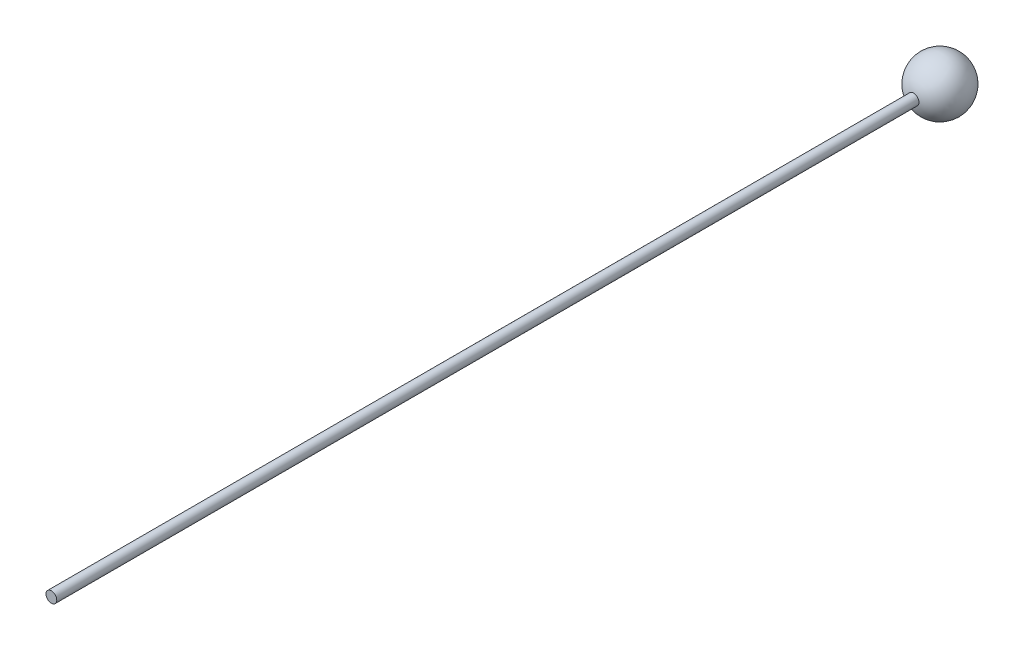
ISO-10303-21;
HEADER;
FILE_DESCRIPTION(('STEP AP214'),'2;1');
FILE_NAME('part.step','',(''),(''),'','','');
FILE_SCHEMA(('AUTOMOTIVE_DESIGN { 1 0 10303 214 1 1 1 1 }'));
ENDSEC;
DATA;
#1=APPLICATION_CONTEXT('core data for automotive mechanical design processes');
#2=APPLICATION_PROTOCOL_DEFINITION('international standard','automotive_design',2000,#1);
#3=PRODUCT_CONTEXT('',#1,'mechanical');
#4=PRODUCT('Part','Part','',(#3));
#5=PRODUCT_RELATED_PRODUCT_CATEGORY('part','',(#4));
#6=PRODUCT_DEFINITION_FORMATION('','',#4);
#7=PRODUCT_DEFINITION_CONTEXT('part definition',#1,'design');
#8=PRODUCT_DEFINITION('design','',#6,#7);
#9=PRODUCT_DEFINITION_SHAPE('','',#8);
#10=(LENGTH_UNIT() NAMED_UNIT(*) SI_UNIT(.MILLI.,.METRE.));
#11=(NAMED_UNIT(*) PLANE_ANGLE_UNIT() SI_UNIT($,.RADIAN.));
#12=(NAMED_UNIT(*) SI_UNIT($,.STERADIAN.) SOLID_ANGLE_UNIT());
#13=UNCERTAINTY_MEASURE_WITH_UNIT(LENGTH_MEASURE(1.E-05),#10,'distance_accuracy_value','');
#14=(GEOMETRIC_REPRESENTATION_CONTEXT(3) GLOBAL_UNCERTAINTY_ASSIGNED_CONTEXT((#13)) GLOBAL_UNIT_ASSIGNED_CONTEXT((#10,
#11,#12)) REPRESENTATION_CONTEXT('',''));
#15=CARTESIAN_POINT('',(0.,0.,0.));
#16=DIRECTION('',(0.,0.,1.));
#17=DIRECTION('',(1.,0.,0.));
#18=AXIS2_PLACEMENT_3D('',#15,#16,#17);
#19=CARTESIAN_POINT('',(0.,0.,-85.002));
#20=DIRECTION('',(0.,0.,1.));
#21=DIRECTION('',(1.,0.,0.));
#22=AXIS2_PLACEMENT_3D('',#19,#20,#21);
#23=CYLINDRICAL_SURFACE('',#22,0.5);
#24=CARTESIAN_POINT('',(0.,0.,0.));
#25=DIRECTION('',(0.,0.,1.));
#26=DIRECTION('',(1.,0.,0.));
#27=AXIS2_PLACEMENT_3D('',#24,#25,#26);
#28=CIRCLE('',#27,0.5);
#29=CARTESIAN_POINT('',(0.5,0.,0.));
#30=VERTEX_POINT('',#29);
#31=EDGE_CURVE('E10',#30,#30,#28,.T.);
#32=ORIENTED_EDGE('',*,*,#31,.F.);
#33=EDGE_LOOP('',(#32));
#34=FACE_BOUND('',#33,.T.);
#35=CARTESIAN_POINT('',(0.,0.,-80.0505102572168));
#36=DIRECTION('',(0.,0.,-1.));
#37=DIRECTION('',(-1.,0.,0.));
#38=AXIS2_PLACEMENT_3D('',#35,#36,#37);
#39=CIRCLE('',#38,0.5);
#40=CARTESIAN_POINT('',(-0.5,0.,-80.0505102572168));
#41=VERTEX_POINT('',#40);
#42=EDGE_CURVE('E51',#41,#41,#39,.F.);
#43=ORIENTED_EDGE('',*,*,#42,.T.);
#44=EDGE_LOOP('',(#43));
#45=FACE_BOUND('',#44,.T.);
#46=ADVANCED_FACE('F43',(#34,#45),#23,.T.);
#47=CARTESIAN_POINT('',(0.,0.,0.));
#48=DIRECTION('',(0.,0.,1.));
#49=DIRECTION('',(1.,0.,0.));
#50=AXIS2_PLACEMENT_3D('',#47,#48,#49);
#51=PLANE('',#50);
#52=ORIENTED_EDGE('',*,*,#31,.T.);
#53=EDGE_LOOP('',(#52));
#54=FACE_BOUND('',#53,.T.);
#55=ADVANCED_FACE('F60',(#54),#51,.T.);
#56=CARTESIAN_POINT('',(0.,0.,-82.5));
#57=DIRECTION('',(0.,0.,1.));
#58=DIRECTION('',(1.,0.,0.));
#59=AXIS2_PLACEMENT_3D('',#56,#57,#58);
#60=SPHERICAL_SURFACE('',#59,2.5);
#61=ORIENTED_EDGE('',*,*,#42,.F.);
#62=EDGE_LOOP('',(#61));
#63=FACE_BOUND('',#62,.T.);
#64=ADVANCED_FACE('F45',(#63),#60,.T.);
#65=CLOSED_SHELL('',(#46,#55,#64));
#66=MANIFOLD_SOLID_BREP('B2',#65);
#67=ADVANCED_BREP_SHAPE_REPRESENTATION('',(#18,#66),#14);
#68=SHAPE_DEFINITION_REPRESENTATION(#9,#67);
ENDSEC;
END-ISO-10303-21;
